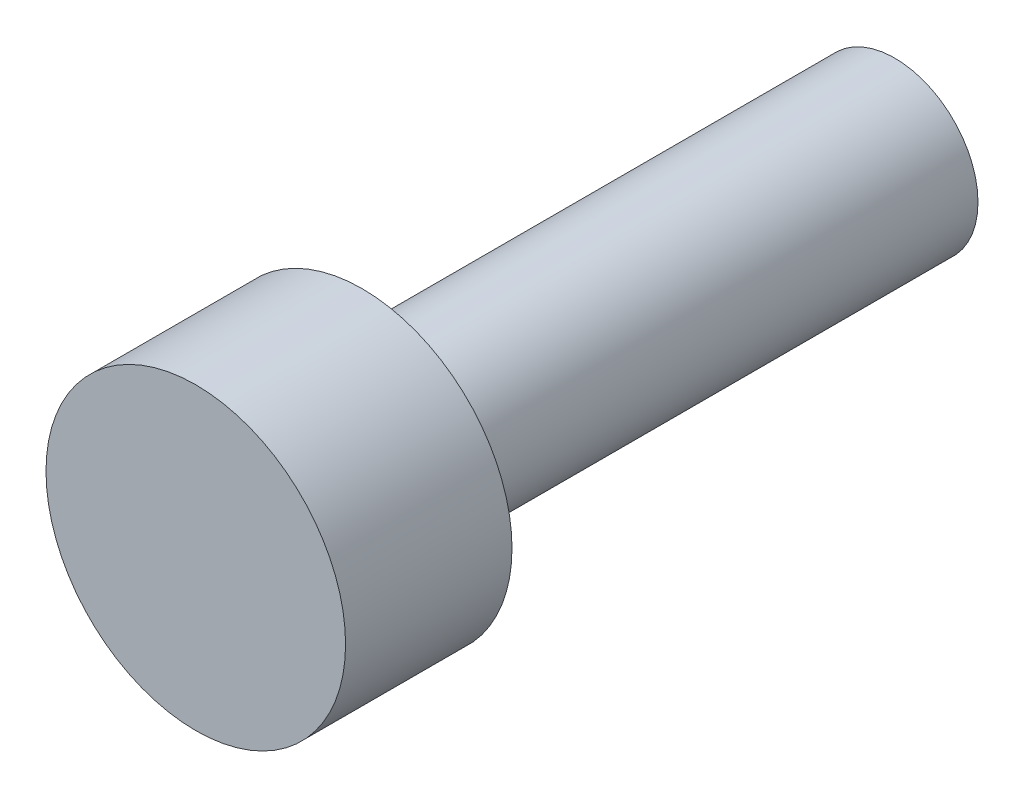
ISO-10303-21;
HEADER;
FILE_DESCRIPTION(('STEP AP214'),'2;1');
FILE_NAME('part.step','',(''),(''),'','','');
FILE_SCHEMA(('AUTOMOTIVE_DESIGN { 1 0 10303 214 1 1 1 1 }'));
ENDSEC;
DATA;
#1=APPLICATION_CONTEXT('core data for automotive mechanical design processes');
#2=APPLICATION_PROTOCOL_DEFINITION('international standard','automotive_design',2000,#1);
#3=PRODUCT_CONTEXT('',#1,'mechanical');
#4=PRODUCT('Part','Part','',(#3));
#5=PRODUCT_RELATED_PRODUCT_CATEGORY('part','',(#4));
#6=PRODUCT_DEFINITION_FORMATION('','',#4);
#7=PRODUCT_DEFINITION_CONTEXT('part definition',#1,'design');
#8=PRODUCT_DEFINITION('design','',#6,#7);
#9=PRODUCT_DEFINITION_SHAPE('','',#8);
#10=(LENGTH_UNIT() NAMED_UNIT(*) SI_UNIT(.MILLI.,.METRE.));
#11=(NAMED_UNIT(*) PLANE_ANGLE_UNIT() SI_UNIT($,.RADIAN.));
#12=(NAMED_UNIT(*) SI_UNIT($,.STERADIAN.) SOLID_ANGLE_UNIT());
#13=UNCERTAINTY_MEASURE_WITH_UNIT(LENGTH_MEASURE(1.E-05),#10,'distance_accuracy_value','');
#14=(GEOMETRIC_REPRESENTATION_CONTEXT(3) GLOBAL_UNCERTAINTY_ASSIGNED_CONTEXT((#13)) GLOBAL_UNIT_ASSIGNED_CONTEXT((#10,
#11,#12)) REPRESENTATION_CONTEXT('',''));
#15=CARTESIAN_POINT('',(0.,0.,0.));
#16=DIRECTION('',(0.,0.,1.));
#17=DIRECTION('',(1.,0.,0.));
#18=AXIS2_PLACEMENT_3D('',#15,#16,#17);
#19=CARTESIAN_POINT('',(0.,0.,0.));
#20=DIRECTION('',(0.,0.,-1.));
#21=DIRECTION('',(-1.,0.,0.));
#22=AXIS2_PLACEMENT_3D('',#19,#20,#21);
#23=CYLINDRICAL_SURFACE('',#22,1.25);
#24=CARTESIAN_POINT('',(0.,0.,0.));
#25=DIRECTION('',(0.,0.,1.));
#26=DIRECTION('',(1.,0.,0.));
#27=AXIS2_PLACEMENT_3D('',#24,#25,#26);
#28=CIRCLE('',#27,1.25);
#29=CARTESIAN_POINT('',(1.25,0.,0.));
#30=VERTEX_POINT('',#29);
#31=EDGE_CURVE('E10',#30,#30,#28,.T.);
#32=ORIENTED_EDGE('',*,*,#31,.F.);
#33=EDGE_LOOP('',(#32));
#34=FACE_BOUND('',#33,.T.);
#35=CARTESIAN_POINT('',(0.,0.,-8.));
#36=DIRECTION('',(0.,0.,1.));
#37=DIRECTION('',(1.,0.,0.));
#38=AXIS2_PLACEMENT_3D('',#35,#36,#37);
#39=CIRCLE('',#38,1.25);
#40=CARTESIAN_POINT('',(1.25,0.,-8.));
#41=VERTEX_POINT('',#40);
#42=EDGE_CURVE('E37',#41,#41,#39,.T.);
#43=ORIENTED_EDGE('',*,*,#42,.T.);
#44=EDGE_LOOP('',(#43));
#45=FACE_BOUND('',#44,.T.);
#46=ADVANCED_FACE('F40',(#34,#45),#23,.T.);
#47=CARTESIAN_POINT('',(0.,0.,-8.));
#48=DIRECTION('',(0.,0.,1.));
#49=DIRECTION('',(1.,0.,0.));
#50=AXIS2_PLACEMENT_3D('',#47,#48,#49);
#51=PLANE('',#50);
#52=ORIENTED_EDGE('',*,*,#42,.F.);
#53=EDGE_LOOP('',(#52));
#54=FACE_BOUND('',#53,.T.);
#55=ADVANCED_FACE('F58',(#54),#51,.F.);
#56=CARTESIAN_POINT('',(0.,0.,2.5));
#57=DIRECTION('',(0.,0.,-1.));
#58=DIRECTION('',(-1.,0.,0.));
#59=AXIS2_PLACEMENT_3D('',#56,#57,#58);
#60=CYLINDRICAL_SURFACE('',#59,2.25);
#61=CARTESIAN_POINT('',(0.,0.,2.5));
#62=DIRECTION('',(0.,0.,1.));
#63=DIRECTION('',(1.,0.,0.));
#64=AXIS2_PLACEMENT_3D('',#61,#62,#63);
#65=CIRCLE('',#64,2.25);
#66=CARTESIAN_POINT('',(2.25,0.,2.5));
#67=VERTEX_POINT('',#66);
#68=EDGE_CURVE('E50',#67,#67,#65,.T.);
#69=ORIENTED_EDGE('',*,*,#68,.F.);
#70=EDGE_LOOP('',(#69));
#71=FACE_BOUND('',#70,.T.);
#72=CARTESIAN_POINT('',(0.,0.,0.));
#73=DIRECTION('',(0.,0.,1.));
#74=DIRECTION('',(1.,0.,0.));
#75=AXIS2_PLACEMENT_3D('',#72,#73,#74);
#76=CIRCLE('',#75,2.25);
#77=CARTESIAN_POINT('',(2.25,0.,0.));
#78=VERTEX_POINT('',#77);
#79=EDGE_CURVE('E47',#78,#78,#76,.T.);
#80=ORIENTED_EDGE('',*,*,#79,.T.);
#81=EDGE_LOOP('',(#80));
#82=FACE_BOUND('',#81,.T.);
#83=ADVANCED_FACE('F60',(#71,#82),#60,.T.);
#84=CARTESIAN_POINT('',(0.,0.,2.5));
#85=DIRECTION('',(0.,0.,1.));
#86=DIRECTION('',(1.,0.,0.));
#87=AXIS2_PLACEMENT_3D('',#84,#85,#86);
#88=PLANE('',#87);
#89=ORIENTED_EDGE('',*,*,#68,.T.);
#90=EDGE_LOOP('',(#89));
#91=FACE_BOUND('',#90,.T.);
#92=ADVANCED_FACE('F54',(#91),#88,.T.);
#93=CARTESIAN_POINT('',(0.,0.,0.));
#94=DIRECTION('',(0.,0.,1.));
#95=DIRECTION('',(1.,0.,0.));
#96=AXIS2_PLACEMENT_3D('',#93,#94,#95);
#97=PLANE('',#96);
#98=ORIENTED_EDGE('',*,*,#31,.T.);
#99=EDGE_LOOP('',(#98));
#100=FACE_BOUND('',#99,.T.);
#101=ORIENTED_EDGE('',*,*,#79,.F.);
#102=EDGE_LOOP('',(#101));
#103=FACE_BOUND('',#102,.T.);
#104=ADVANCED_FACE('F63',(#100,#103),#97,.F.);
#105=CLOSED_SHELL('',(#46,#55,#83,#92,#104));
#106=MANIFOLD_SOLID_BREP('B2',#105);
#107=ADVANCED_BREP_SHAPE_REPRESENTATION('',(#18,#106),#14);
#108=SHAPE_DEFINITION_REPRESENTATION(#9,#107);
ENDSEC;
END-ISO-10303-21;
